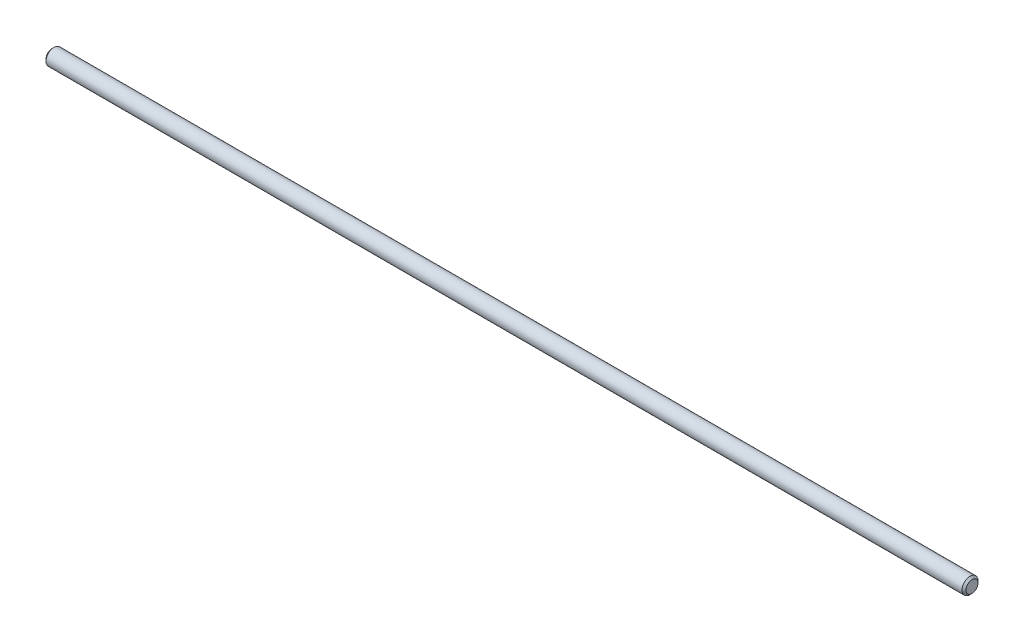
ISO-10303-21;
HEADER;
FILE_DESCRIPTION(('STEP AP214'),'2;1');
FILE_NAME('part.step','',(''),(''),'','','');
FILE_SCHEMA(('AUTOMOTIVE_DESIGN { 1 0 10303 214 1 1 1 1 }'));
ENDSEC;
DATA;
#1=APPLICATION_CONTEXT('core data for automotive mechanical design processes');
#2=APPLICATION_PROTOCOL_DEFINITION('international standard','automotive_design',2000,#1);
#3=PRODUCT_CONTEXT('',#1,'mechanical');
#4=PRODUCT('Part','Part','',(#3));
#5=PRODUCT_RELATED_PRODUCT_CATEGORY('part','',(#4));
#6=PRODUCT_DEFINITION_FORMATION('','',#4);
#7=PRODUCT_DEFINITION_CONTEXT('part definition',#1,'design');
#8=PRODUCT_DEFINITION('design','',#6,#7);
#9=PRODUCT_DEFINITION_SHAPE('','',#8);
#10=(LENGTH_UNIT() NAMED_UNIT(*) SI_UNIT(.MILLI.,.METRE.));
#11=(NAMED_UNIT(*) PLANE_ANGLE_UNIT() SI_UNIT($,.RADIAN.));
#12=(NAMED_UNIT(*) SI_UNIT($,.STERADIAN.) SOLID_ANGLE_UNIT());
#13=UNCERTAINTY_MEASURE_WITH_UNIT(LENGTH_MEASURE(1.E-05),#10,'distance_accuracy_value','');
#14=(GEOMETRIC_REPRESENTATION_CONTEXT(3) GLOBAL_UNCERTAINTY_ASSIGNED_CONTEXT((#13)) GLOBAL_UNIT_ASSIGNED_CONTEXT((#10,
#11,#12)) REPRESENTATION_CONTEXT('',''));
#15=CARTESIAN_POINT('',(0.,0.,0.));
#16=DIRECTION('',(0.,0.,1.));
#17=DIRECTION('',(1.,0.,0.));
#18=AXIS2_PLACEMENT_3D('',#15,#16,#17);
#19=CARTESIAN_POINT('',(230.,0.,0.));
#20=DIRECTION('',(-1.,0.,0.));
#21=DIRECTION('',(0.,0.,1.));
#22=AXIS2_PLACEMENT_3D('',#19,#20,#21);
#23=CYLINDRICAL_SURFACE('',#22,4.);
#24=CARTESIAN_POINT('',(229.,0.,0.));
#25=DIRECTION('',(1.,0.,0.));
#26=DIRECTION('',(0.,0.,-1.));
#27=AXIS2_PLACEMENT_3D('',#24,#25,#26);
#28=CIRCLE('',#27,4.);
#29=CARTESIAN_POINT('',(229.,0.,-4.));
#30=VERTEX_POINT('',#29);
#31=EDGE_CURVE('E38',#30,#30,#28,.F.);
#32=ORIENTED_EDGE('',*,*,#31,.T.);
#33=EDGE_LOOP('',(#32));
#34=FACE_BOUND('',#33,.T.);
#35=CARTESIAN_POINT('',(-229.,0.,0.));
#36=DIRECTION('',(1.,0.,0.));
#37=DIRECTION('',(0.,0.,-1.));
#38=AXIS2_PLACEMENT_3D('',#35,#36,#37);
#39=CIRCLE('',#38,4.);
#40=CARTESIAN_POINT('',(-229.,0.,-4.));
#41=VERTEX_POINT('',#40);
#42=EDGE_CURVE('E42',#41,#41,#39,.T.);
#43=ORIENTED_EDGE('',*,*,#42,.T.);
#44=EDGE_LOOP('',(#43));
#45=FACE_BOUND('',#44,.T.);
#46=ADVANCED_FACE('F31',(#34,#45),#23,.T.);
#47=CARTESIAN_POINT('',(230.,0.,0.));
#48=DIRECTION('',(1.,0.,0.));
#49=DIRECTION('',(0.,0.,-1.));
#50=AXIS2_PLACEMENT_3D('',#47,#48,#49);
#51=PLANE('',#50);
#52=CARTESIAN_POINT('',(230.,0.,0.));
#53=DIRECTION('',(1.,0.,0.));
#54=DIRECTION('',(0.,0.,-1.));
#55=AXIS2_PLACEMENT_3D('',#52,#53,#54);
#56=CIRCLE('',#55,3.);
#57=CARTESIAN_POINT('',(230.,0.,-3.));
#58=VERTEX_POINT('',#57);
#59=EDGE_CURVE('E46',#58,#58,#56,.T.);
#60=ORIENTED_EDGE('',*,*,#59,.T.);
#61=EDGE_LOOP('',(#60));
#62=FACE_BOUND('',#61,.T.);
#63=ADVANCED_FACE('F52',(#62),#51,.T.);
#64=CARTESIAN_POINT('',(-230.,0.,0.));
#65=DIRECTION('',(1.,0.,0.));
#66=DIRECTION('',(0.,0.,-1.));
#67=AXIS2_PLACEMENT_3D('',#64,#65,#66);
#68=PLANE('',#67);
#69=CARTESIAN_POINT('',(-230.,0.,0.));
#70=DIRECTION('',(1.,0.,0.));
#71=DIRECTION('',(0.,0.,-1.));
#72=AXIS2_PLACEMENT_3D('',#69,#70,#71);
#73=CIRCLE('',#72,3.);
#74=CARTESIAN_POINT('',(-230.,0.,-3.));
#75=VERTEX_POINT('',#74);
#76=EDGE_CURVE('E10',#75,#75,#73,.F.);
#77=ORIENTED_EDGE('',*,*,#76,.T.);
#78=EDGE_LOOP('',(#77));
#79=FACE_BOUND('',#78,.T.);
#80=ADVANCED_FACE('F56',(#79),#68,.F.);
#81=CARTESIAN_POINT('',(230.,0.,0.));
#82=DIRECTION('',(-1.,0.,0.));
#83=DIRECTION('',(0.,0.,1.));
#84=AXIS2_PLACEMENT_3D('',#81,#82,#83);
#85=CONICAL_SURFACE('',#84,3.,0.785398163397474);
#86=ORIENTED_EDGE('',*,*,#31,.F.);
#87=EDGE_LOOP('',(#86));
#88=FACE_BOUND('',#87,.T.);
#89=ORIENTED_EDGE('',*,*,#59,.F.);
#90=EDGE_LOOP('',(#89));
#91=FACE_BOUND('',#90,.T.);
#92=ADVANCED_FACE('F54',(#88,#91),#85,.T.);
#93=CARTESIAN_POINT('',(-229.,0.,0.));
#94=DIRECTION('',(1.,0.,0.));
#95=DIRECTION('',(0.,0.,-1.));
#96=AXIS2_PLACEMENT_3D('',#93,#94,#95);
#97=CONICAL_SURFACE('',#96,4.,0.785398163397447);
#98=ORIENTED_EDGE('',*,*,#76,.F.);
#99=EDGE_LOOP('',(#98));
#100=FACE_BOUND('',#99,.T.);
#101=ORIENTED_EDGE('',*,*,#42,.F.);
#102=EDGE_LOOP('',(#101));
#103=FACE_BOUND('',#102,.T.);
#104=ADVANCED_FACE('F33',(#100,#103),#97,.T.);
#105=CLOSED_SHELL('',(#46,#63,#80,#92,#104));
#106=MANIFOLD_SOLID_BREP('B2',#105);
#107=ADVANCED_BREP_SHAPE_REPRESENTATION('',(#18,#106),#14);
#108=SHAPE_DEFINITION_REPRESENTATION(#9,#107);
ENDSEC;
END-ISO-10303-21;
